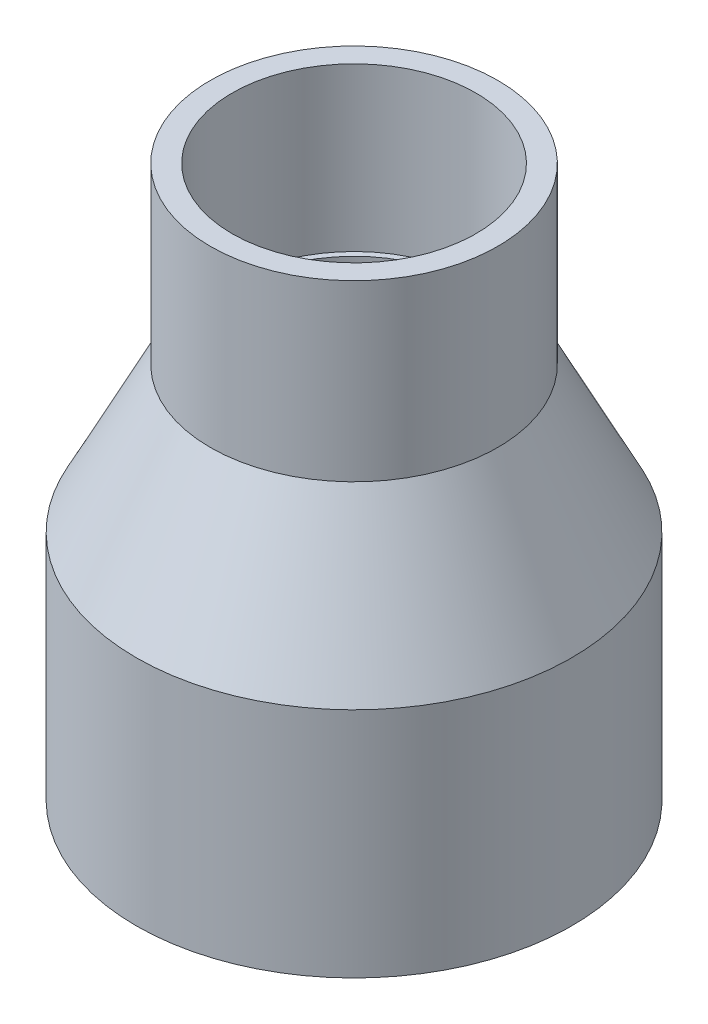
ISO-10303-21;
HEADER;
FILE_DESCRIPTION(('STEP AP214'),'2;1');
FILE_NAME('part.step','',(''),(''),'','','');
FILE_SCHEMA(('AUTOMOTIVE_DESIGN { 1 0 10303 214 1 1 1 1 }'));
ENDSEC;
DATA;
#1=APPLICATION_CONTEXT('core data for automotive mechanical design processes');
#2=APPLICATION_PROTOCOL_DEFINITION('international standard','automotive_design',2000,#1);
#3=PRODUCT_CONTEXT('',#1,'mechanical');
#4=PRODUCT('Part','Part','',(#3));
#5=PRODUCT_RELATED_PRODUCT_CATEGORY('part','',(#4));
#6=PRODUCT_DEFINITION_FORMATION('','',#4);
#7=PRODUCT_DEFINITION_CONTEXT('part definition',#1,'design');
#8=PRODUCT_DEFINITION('design','',#6,#7);
#9=PRODUCT_DEFINITION_SHAPE('','',#8);
#10=(LENGTH_UNIT() NAMED_UNIT(*) SI_UNIT(.MILLI.,.METRE.));
#11=(NAMED_UNIT(*) PLANE_ANGLE_UNIT() SI_UNIT($,.RADIAN.));
#12=(NAMED_UNIT(*) SI_UNIT($,.STERADIAN.) SOLID_ANGLE_UNIT());
#13=UNCERTAINTY_MEASURE_WITH_UNIT(LENGTH_MEASURE(1.E-05),#10,'distance_accuracy_value','');
#14=(GEOMETRIC_REPRESENTATION_CONTEXT(3) GLOBAL_UNCERTAINTY_ASSIGNED_CONTEXT((#13)) GLOBAL_UNIT_ASSIGNED_CONTEXT((#10,
#11,#12)) REPRESENTATION_CONTEXT('',''));
#15=CARTESIAN_POINT('',(0.,0.,0.));
#16=DIRECTION('',(0.,0.,1.));
#17=DIRECTION('',(1.,0.,0.));
#18=AXIS2_PLACEMENT_3D('',#15,#16,#17);
#19=CARTESIAN_POINT('',(0.,35.,0.));
#20=DIRECTION('',(0.,1.,0.));
#21=DIRECTION('',(0.,0.,1.));
#22=AXIS2_PLACEMENT_3D('',#19,#20,#21);
#23=CYLINDRICAL_SURFACE('',#22,21.);
#24=CARTESIAN_POINT('',(0.,65.,0.));
#25=DIRECTION('',(0.,1.,0.));
#26=DIRECTION('',(0.,0.,1.));
#27=AXIS2_PLACEMENT_3D('',#24,#25,#26);
#28=CIRCLE('',#27,21.);
#29=CARTESIAN_POINT('',(0.,65.,21.));
#30=VERTEX_POINT('',#29);
#31=EDGE_CURVE('E86',#30,#30,#28,.T.);
#32=ORIENTED_EDGE('',*,*,#31,.T.);
#33=EDGE_LOOP('',(#32));
#34=FACE_BOUND('',#33,.T.);
#35=CARTESIAN_POINT('',(0.,39.,0.));
#36=DIRECTION('',(0.,-1.,0.));
#37=DIRECTION('',(0.,0.,-1.));
#38=AXIS2_PLACEMENT_3D('',#35,#36,#37);
#39=CIRCLE('',#38,21.);
#40=CARTESIAN_POINT('',(0.,39.,-21.));
#41=VERTEX_POINT('',#40);
#42=EDGE_CURVE('E70',#41,#41,#39,.F.);
#43=ORIENTED_EDGE('',*,*,#42,.F.);
#44=EDGE_LOOP('',(#43));
#45=FACE_BOUND('',#44,.T.);
#46=ADVANCED_FACE('F51',(#34,#45),#23,.F.);
#47=CARTESIAN_POINT('',(0.,65.,0.));
#48=DIRECTION('',(0.,-1.,0.));
#49=DIRECTION('',(0.,0.,-1.));
#50=AXIS2_PLACEMENT_3D('',#47,#48,#49);
#51=CYLINDRICAL_SURFACE('',#50,37.5);
#52=CARTESIAN_POINT('',(0.,39.9999999999999,0.));
#53=DIRECTION('',(0.,1.,0.));
#54=DIRECTION('',(0.,0.,1.));
#55=AXIS2_PLACEMENT_3D('',#52,#53,#54);
#56=CIRCLE('',#55,37.5);
#57=CARTESIAN_POINT('',(0.,39.9999999999999,37.5));
#58=VERTEX_POINT('',#57);
#59=EDGE_CURVE('E10',#58,#58,#56,.F.);
#60=ORIENTED_EDGE('',*,*,#59,.T.);
#61=EDGE_LOOP('',(#60));
#62=FACE_BOUND('',#61,.T.);
#63=CARTESIAN_POINT('',(0.,0.,0.));
#64=DIRECTION('',(0.,1.,0.));
#65=DIRECTION('',(0.,0.,1.));
#66=AXIS2_PLACEMENT_3D('',#63,#64,#65);
#67=CIRCLE('',#66,37.5);
#68=CARTESIAN_POINT('',(0.,0.,37.5));
#69=VERTEX_POINT('',#68);
#70=EDGE_CURVE('E67',#69,#69,#67,.T.);
#71=ORIENTED_EDGE('',*,*,#70,.T.);
#72=EDGE_LOOP('',(#71));
#73=FACE_BOUND('',#72,.T.);
#74=ADVANCED_FACE('F133',(#62,#73),#51,.T.);
#75=CARTESIAN_POINT('',(0.,0.,0.));
#76=DIRECTION('',(0.,1.,0.));
#77=DIRECTION('',(0.,0.,1.));
#78=AXIS2_PLACEMENT_3D('',#75,#76,#77);
#79=PLANE('',#78);
#80=CARTESIAN_POINT('',(0.,0.,0.));
#81=DIRECTION('',(0.,-1.,0.));
#82=DIRECTION('',(0.,0.,-1.));
#83=AXIS2_PLACEMENT_3D('',#80,#81,#82);
#84=CIRCLE('',#83,35.);
#85=CARTESIAN_POINT('',(0.,0.,-35.));
#86=VERTEX_POINT('',#85);
#87=EDGE_CURVE('E80',#86,#86,#84,.T.);
#88=ORIENTED_EDGE('',*,*,#87,.F.);
#89=EDGE_LOOP('',(#88));
#90=FACE_BOUND('',#89,.T.);
#91=ORIENTED_EDGE('',*,*,#70,.F.);
#92=EDGE_LOOP('',(#91));
#93=FACE_BOUND('',#92,.T.);
#94=ADVANCED_FACE('F138',(#90,#93),#79,.F.);
#95=CARTESIAN_POINT('',(0.,65.,0.));
#96=DIRECTION('',(0.,-1.,0.));
#97=DIRECTION('',(0.,0.,-1.));
#98=AXIS2_PLACEMENT_3D('',#95,#96,#97);
#99=CONICAL_SURFACE('',#98,24.7618637626393,0.471238898038466);
#100=ORIENTED_EDGE('',*,*,#59,.F.);
#101=EDGE_LOOP('',(#100));
#102=FACE_BOUND('',#101,.T.);
#103=CARTESIAN_POINT('',(0.,65.,0.));
#104=DIRECTION('',(0.,1.,0.));
#105=DIRECTION('',(0.,0.,1.));
#106=AXIS2_PLACEMENT_3D('',#103,#104,#105);
#107=CIRCLE('',#106,24.7618637626393);
#108=CARTESIAN_POINT('',(0.,65.,24.7618637626393));
#109=VERTEX_POINT('',#108);
#110=EDGE_CURVE('E61',#109,#109,#107,.T.);
#111=ORIENTED_EDGE('',*,*,#110,.F.);
#112=EDGE_LOOP('',(#111));
#113=FACE_BOUND('',#112,.T.);
#114=ADVANCED_FACE('F54',(#102,#113),#99,.T.);
#115=CARTESIAN_POINT('',(0.,39.,0.));
#116=DIRECTION('',(0.,-1.,0.));
#117=DIRECTION('',(0.,0.,-1.));
#118=AXIS2_PLACEMENT_3D('',#115,#116,#117);
#119=PLANE('',#118);
#120=CARTESIAN_POINT('',(0.,39.,0.));
#121=DIRECTION('',(0.,-1.,0.));
#122=DIRECTION('',(0.,0.,-1.));
#123=AXIS2_PLACEMENT_3D('',#120,#121,#122);
#124=CIRCLE('',#123,35.);
#125=CARTESIAN_POINT('',(0.,39.,-35.));
#126=VERTEX_POINT('',#125);
#127=EDGE_CURVE('E73',#126,#126,#124,.T.);
#128=ORIENTED_EDGE('',*,*,#127,.T.);
#129=EDGE_LOOP('',(#128));
#130=FACE_BOUND('',#129,.T.);
#131=ORIENTED_EDGE('',*,*,#42,.T.);
#132=EDGE_LOOP('',(#131));
#133=FACE_BOUND('',#132,.T.);
#134=ADVANCED_FACE('F149',(#130,#133),#119,.T.);
#135=CARTESIAN_POINT('',(0.,39.,0.));
#136=DIRECTION('',(0.,-1.,0.));
#137=DIRECTION('',(0.,0.,-1.));
#138=AXIS2_PLACEMENT_3D('',#135,#136,#137);
#139=CYLINDRICAL_SURFACE('',#138,35.);
#140=ORIENTED_EDGE('',*,*,#127,.F.);
#141=EDGE_LOOP('',(#140));
#142=FACE_BOUND('',#141,.T.);
#143=ORIENTED_EDGE('',*,*,#87,.T.);
#144=EDGE_LOOP('',(#143));
#145=FACE_BOUND('',#144,.T.);
#146=ADVANCED_FACE('F142',(#142,#145),#139,.F.);
#147=CARTESIAN_POINT('',(0.,65.,0.));
#148=DIRECTION('',(0.,1.,0.));
#149=DIRECTION('',(0.,0.,1.));
#150=AXIS2_PLACEMENT_3D('',#147,#148,#149);
#151=PLANE('',#150);
#152=CARTESIAN_POINT('',(0.,65.,0.));
#153=DIRECTION('',(0.,1.,0.));
#154=DIRECTION('',(0.,0.,1.));
#155=AXIS2_PLACEMENT_3D('',#152,#153,#154);
#156=CIRCLE('',#155,20.);
#157=CARTESIAN_POINT('',(0.,65.,20.));
#158=VERTEX_POINT('',#157);
#159=EDGE_CURVE('E56',#158,#158,#156,.T.);
#160=ORIENTED_EDGE('',*,*,#159,.T.);
#161=EDGE_LOOP('',(#160));
#162=FACE_BOUND('',#161,.T.);
#163=ORIENTED_EDGE('',*,*,#31,.F.);
#164=EDGE_LOOP('',(#163));
#165=FACE_BOUND('',#164,.T.);
#166=ADVANCED_FACE('F119',(#162,#165),#151,.F.);
#167=CARTESIAN_POINT('',(0.,95.,0.));
#168=DIRECTION('',(0.,-1.,0.));
#169=DIRECTION('',(0.,0.,-1.));
#170=AXIS2_PLACEMENT_3D('',#167,#168,#169);
#171=CYLINDRICAL_SURFACE('',#170,24.7618637626393);
#172=CARTESIAN_POINT('',(0.,95.,0.));
#173=DIRECTION('',(0.,1.,0.));
#174=DIRECTION('',(0.,0.,1.));
#175=AXIS2_PLACEMENT_3D('',#172,#173,#174);
#176=CIRCLE('',#175,24.7618637626393);
#177=CARTESIAN_POINT('',(0.,95.,24.7618637626393));
#178=VERTEX_POINT('',#177);
#179=EDGE_CURVE('E89',#178,#178,#176,.T.);
#180=ORIENTED_EDGE('',*,*,#179,.F.);
#181=EDGE_LOOP('',(#180));
#182=FACE_BOUND('',#181,.T.);
#183=ORIENTED_EDGE('',*,*,#110,.T.);
#184=EDGE_LOOP('',(#183));
#185=FACE_BOUND('',#184,.T.);
#186=ADVANCED_FACE('F162',(#182,#185),#171,.T.);
#187=CARTESIAN_POINT('',(0.,95.,0.));
#188=DIRECTION('',(0.,1.,0.));
#189=DIRECTION('',(0.,0.,1.));
#190=AXIS2_PLACEMENT_3D('',#187,#188,#189);
#191=PLANE('',#190);
#192=CARTESIAN_POINT('',(0.,95.,0.));
#193=DIRECTION('',(0.,1.,0.));
#194=DIRECTION('',(0.,0.,1.));
#195=AXIS2_PLACEMENT_3D('',#192,#193,#194);
#196=CIRCLE('',#195,21.);
#197=CARTESIAN_POINT('',(0.,95.,21.));
#198=VERTEX_POINT('',#197);
#199=EDGE_CURVE('E103',#198,#198,#196,.T.);
#200=ORIENTED_EDGE('',*,*,#199,.F.);
#201=EDGE_LOOP('',(#200));
#202=FACE_BOUND('',#201,.T.);
#203=ORIENTED_EDGE('',*,*,#179,.T.);
#204=EDGE_LOOP('',(#203));
#205=FACE_BOUND('',#204,.T.);
#206=ADVANCED_FACE('F168',(#202,#205),#191,.T.);
#207=CARTESIAN_POINT('',(0.,67.,0.));
#208=DIRECTION('',(0.,1.,0.));
#209=DIRECTION('',(0.,0.,1.));
#210=AXIS2_PLACEMENT_3D('',#207,#208,#209);
#211=CYLINDRICAL_SURFACE('',#210,21.);
#212=CARTESIAN_POINT('',(0.,67.,0.));
#213=DIRECTION('',(0.,1.,0.));
#214=DIRECTION('',(0.,0.,1.));
#215=AXIS2_PLACEMENT_3D('',#212,#213,#214);
#216=CIRCLE('',#215,21.);
#217=CARTESIAN_POINT('',(0.,67.,21.));
#218=VERTEX_POINT('',#217);
#219=EDGE_CURVE('E98',#218,#218,#216,.T.);
#220=ORIENTED_EDGE('',*,*,#219,.F.);
#221=EDGE_LOOP('',(#220));
#222=FACE_BOUND('',#221,.T.);
#223=ORIENTED_EDGE('',*,*,#199,.T.);
#224=EDGE_LOOP('',(#223));
#225=FACE_BOUND('',#224,.T.);
#226=ADVANCED_FACE('F129',(#222,#225),#211,.F.);
#227=CARTESIAN_POINT('',(0.,67.,0.));
#228=DIRECTION('',(0.,1.,0.));
#229=DIRECTION('',(0.,0.,1.));
#230=AXIS2_PLACEMENT_3D('',#227,#228,#229);
#231=PLANE('',#230);
#232=CARTESIAN_POINT('',(0.,67.,0.));
#233=DIRECTION('',(0.,1.,0.));
#234=DIRECTION('',(0.,0.,1.));
#235=AXIS2_PLACEMENT_3D('',#232,#233,#234);
#236=CIRCLE('',#235,20.);
#237=CARTESIAN_POINT('',(0.,67.,20.));
#238=VERTEX_POINT('',#237);
#239=EDGE_CURVE('E110',#238,#238,#236,.T.);
#240=ORIENTED_EDGE('',*,*,#239,.F.);
#241=EDGE_LOOP('',(#240));
#242=FACE_BOUND('',#241,.T.);
#243=ORIENTED_EDGE('',*,*,#219,.T.);
#244=EDGE_LOOP('',(#243));
#245=FACE_BOUND('',#244,.T.);
#246=ADVANCED_FACE('F124',(#242,#245),#231,.T.);
#247=CARTESIAN_POINT('',(0.,37.,0.));
#248=DIRECTION('',(0.,1.,0.));
#249=DIRECTION('',(0.,0.,1.));
#250=AXIS2_PLACEMENT_3D('',#247,#248,#249);
#251=CYLINDRICAL_SURFACE('',#250,20.);
#252=ORIENTED_EDGE('',*,*,#239,.T.);
#253=EDGE_LOOP('',(#252));
#254=FACE_BOUND('',#253,.T.);
#255=ORIENTED_EDGE('',*,*,#159,.F.);
#256=EDGE_LOOP('',(#255));
#257=FACE_BOUND('',#256,.T.);
#258=ADVANCED_FACE('F122',(#254,#257),#251,.F.);
#259=CLOSED_SHELL('',(#46,#74,#94,#114,#134,#146,#166,#186,#206,#226,#246,#258));
#260=MANIFOLD_SOLID_BREP('B2',#259);
#261=ADVANCED_BREP_SHAPE_REPRESENTATION('',(#18,#260),#14);
#262=SHAPE_DEFINITION_REPRESENTATION(#9,#261);
ENDSEC;
END-ISO-10303-21;
